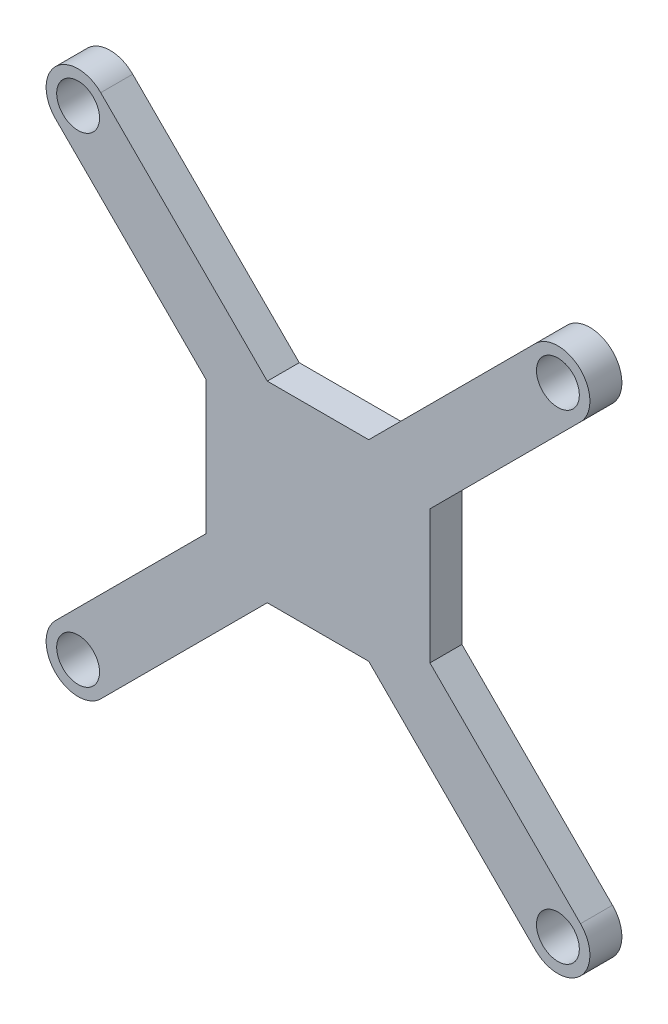
ISO-10303-21;
HEADER;
FILE_DESCRIPTION(('STEP AP214'),'2;1');
FILE_NAME('part.step','',(''),(''),'','','');
FILE_SCHEMA(('AUTOMOTIVE_DESIGN { 1 0 10303 214 1 1 1 1 }'));
ENDSEC;
DATA;
#1=APPLICATION_CONTEXT('core data for automotive mechanical design processes');
#2=APPLICATION_PROTOCOL_DEFINITION('international standard','automotive_design',2000,#1);
#3=PRODUCT_CONTEXT('',#1,'mechanical');
#4=PRODUCT('Part','Part','',(#3));
#5=PRODUCT_RELATED_PRODUCT_CATEGORY('part','',(#4));
#6=PRODUCT_DEFINITION_FORMATION('','',#4);
#7=PRODUCT_DEFINITION_CONTEXT('part definition',#1,'design');
#8=PRODUCT_DEFINITION('design','',#6,#7);
#9=PRODUCT_DEFINITION_SHAPE('','',#8);
#10=(LENGTH_UNIT() NAMED_UNIT(*) SI_UNIT(.MILLI.,.METRE.));
#11=(NAMED_UNIT(*) PLANE_ANGLE_UNIT() SI_UNIT($,.RADIAN.));
#12=(NAMED_UNIT(*) SI_UNIT($,.STERADIAN.) SOLID_ANGLE_UNIT());
#13=UNCERTAINTY_MEASURE_WITH_UNIT(LENGTH_MEASURE(1.E-05),#10,'distance_accuracy_value','');
#14=(GEOMETRIC_REPRESENTATION_CONTEXT(3) GLOBAL_UNCERTAINTY_ASSIGNED_CONTEXT((#13)) GLOBAL_UNIT_ASSIGNED_CONTEXT((#10,
#11,#12)) REPRESENTATION_CONTEXT('',''));
#15=CARTESIAN_POINT('',(0.,0.,0.));
#16=DIRECTION('',(0.,0.,1.));
#17=DIRECTION('',(1.,0.,0.));
#18=AXIS2_PLACEMENT_3D('',#15,#16,#17);
#19=CARTESIAN_POINT('',(37.4176023454291,33.3494710561995,5.));
#20=DIRECTION('',(0.,0.,-1.));
#21=DIRECTION('',(-1.,0.,0.));
#22=AXIS2_PLACEMENT_3D('',#19,#20,#21);
#23=CYLINDRICAL_SURFACE('',#22,5.);
#24=CARTESIAN_POINT('',(37.4176023454291,33.3494710561995,0.));
#25=DIRECTION('',(0.,0.,1.));
#26=DIRECTION('',(-1.,0.,0.));
#27=AXIS2_PLACEMENT_3D('',#24,#25,#26);
#28=CIRCLE('',#27,5.);
#29=CARTESIAN_POINT('',(40.9531362513617,29.8139371502666,0.));
#30=VERTEX_POINT('',#29);
#31=CARTESIAN_POINT('',(33.8820684394965,36.8850049621324,0.));
#32=VERTEX_POINT('',#31);
#33=EDGE_CURVE('E179',#30,#32,#28,.T.);
#34=ORIENTED_EDGE('',*,*,#33,.T.);
#35=DIRECTION('',(0.,0.,-1.));
#36=VECTOR('',#35,1.);
#37=CARTESIAN_POINT('',(33.8820684394965,36.8850049621324,5.));
#38=LINE('',#37,#36);
#39=CARTESIAN_POINT('',(33.8820684394965,36.8850049621324,5.));
#40=VERTEX_POINT('',#39);
#41=EDGE_CURVE('E11',#40,#32,#38,.T.);
#42=ORIENTED_EDGE('',*,*,#41,.F.);
#43=CARTESIAN_POINT('',(37.4176023454291,33.3494710561995,5.));
#44=DIRECTION('',(0.,0.,1.));
#45=DIRECTION('',(-1.,0.,0.));
#46=AXIS2_PLACEMENT_3D('',#43,#44,#45);
#47=CIRCLE('',#46,5.);
#48=CARTESIAN_POINT('',(40.9531362513617,29.8139371502666,5.));
#49=VERTEX_POINT('',#48);
#50=EDGE_CURVE('E210',#49,#40,#47,.T.);
#51=ORIENTED_EDGE('',*,*,#50,.F.);
#52=DIRECTION('',(0.,0.,-1.));
#53=VECTOR('',#52,1.);
#54=CARTESIAN_POINT('',(40.9531362513617,29.8139371502666,5.));
#55=LINE('',#54,#53);
#56=EDGE_CURVE('E175',#49,#30,#55,.T.);
#57=ORIENTED_EDGE('',*,*,#56,.T.);
#58=EDGE_LOOP('',(#34,#42,#51,#57));
#59=FACE_BOUND('',#58,.T.);
#60=ADVANCED_FACE('F35',(#59),#23,.T.);
#61=CARTESIAN_POINT('',(33.8820684394965,36.8850049621324,5.));
#62=DIRECTION('',(0.707106781186547,-0.707106781186548,0.));
#63=DIRECTION('',(0.707106781186548,0.707106781186547,0.));
#64=AXIS2_PLACEMENT_3D('',#61,#62,#63);
#65=PLANE('',#64);
#66=DIRECTION('',(-0.707106781186548,-0.707106781186547,0.));
#67=VECTOR('',#66,1.);
#68=CARTESIAN_POINT('',(33.8820684394965,36.8850049621324,0.));
#69=LINE('',#68,#67);
#70=CARTESIAN_POINT('',(7.84653453356363,10.8494710561995,0.));
#71=VERTEX_POINT('',#70);
#72=EDGE_CURVE('E182',#32,#71,#69,.T.);
#73=ORIENTED_EDGE('',*,*,#72,.T.);
#74=DIRECTION('',(0.,0.,-1.));
#75=VECTOR('',#74,1.);
#76=CARTESIAN_POINT('',(7.84653453356363,10.8494710561995,5.));
#77=LINE('',#76,#75);
#78=CARTESIAN_POINT('',(7.84653453356363,10.8494710561995,5.));
#79=VERTEX_POINT('',#78);
#80=EDGE_CURVE('E43',#79,#71,#77,.T.);
#81=ORIENTED_EDGE('',*,*,#80,.F.);
#82=DIRECTION('',(-0.707106781186548,-0.707106781186547,0.));
#83=VECTOR('',#82,1.);
#84=CARTESIAN_POINT('',(33.8820684394965,36.8850049621324,5.));
#85=LINE('',#84,#83);
#86=EDGE_CURVE('E118',#40,#79,#85,.T.);
#87=ORIENTED_EDGE('',*,*,#86,.F.);
#88=ORIENTED_EDGE('',*,*,#41,.T.);
#89=EDGE_LOOP('',(#73,#81,#87,#88));
#90=FACE_BOUND('',#89,.T.);
#91=ADVANCED_FACE('F309',(#90),#65,.F.);
#92=CARTESIAN_POINT('',(-8.01132984270473,10.8494710561995,5.));
#93=DIRECTION('',(0.,-1.,0.));
#94=DIRECTION('',(1.,0.,0.));
#95=AXIS2_PLACEMENT_3D('',#92,#93,#94);
#96=PLANE('',#95);
#97=DIRECTION('',(-1.,0.,0.));
#98=VECTOR('',#97,1.);
#99=CARTESIAN_POINT('',(-8.01132984270473,10.8494710561995,0.));
#100=LINE('',#99,#98);
#101=CARTESIAN_POINT('',(-8.01132984270473,10.8494710561995,0.));
#102=VERTEX_POINT('',#101);
#103=EDGE_CURVE('E185',#71,#102,#100,.T.);
#104=ORIENTED_EDGE('',*,*,#103,.T.);
#105=DIRECTION('',(0.,0.,-1.));
#106=VECTOR('',#105,1.);
#107=CARTESIAN_POINT('',(-8.01132984270473,10.8494710561995,5.));
#108=LINE('',#107,#106);
#109=CARTESIAN_POINT('',(-8.01132984270473,10.8494710561995,5.));
#110=VERTEX_POINT('',#109);
#111=EDGE_CURVE('E241',#110,#102,#108,.T.);
#112=ORIENTED_EDGE('',*,*,#111,.F.);
#113=DIRECTION('',(-1.,0.,0.));
#114=VECTOR('',#113,1.);
#115=CARTESIAN_POINT('',(-8.01132984270473,10.8494710561995,5.));
#116=LINE('',#115,#114);
#117=EDGE_CURVE('E249',#79,#110,#116,.T.);
#118=ORIENTED_EDGE('',*,*,#117,.F.);
#119=ORIENTED_EDGE('',*,*,#80,.T.);
#120=EDGE_LOOP('',(#104,#112,#118,#119));
#121=FACE_BOUND('',#120,.T.);
#122=ADVANCED_FACE('F247',(#121),#96,.F.);
#123=CARTESIAN_POINT('',(-34.0468637486376,36.8850049621324,5.));
#124=DIRECTION('',(-0.707106781186547,-0.707106781186548,0.));
#125=DIRECTION('',(0.707106781186548,-0.707106781186547,0.));
#126=AXIS2_PLACEMENT_3D('',#123,#124,#125);
#127=PLANE('',#126);
#128=DIRECTION('',(-0.707106781186548,0.707106781186547,0.));
#129=VECTOR('',#128,1.);
#130=CARTESIAN_POINT('',(-34.0468637486376,36.8850049621324,0.));
#131=LINE('',#130,#129);
#132=CARTESIAN_POINT('',(-34.0468637486376,36.8850049621324,0.));
#133=VERTEX_POINT('',#132);
#134=EDGE_CURVE('E187',#102,#133,#131,.T.);
#135=ORIENTED_EDGE('',*,*,#134,.T.);
#136=DIRECTION('',(0.,0.,-1.));
#137=VECTOR('',#136,1.);
#138=CARTESIAN_POINT('',(-34.0468637486376,36.8850049621324,5.));
#139=LINE('',#138,#137);
#140=CARTESIAN_POINT('',(-34.0468637486376,36.8850049621324,5.));
#141=VERTEX_POINT('',#140);
#142=EDGE_CURVE('E238',#141,#133,#139,.T.);
#143=ORIENTED_EDGE('',*,*,#142,.F.);
#144=DIRECTION('',(-0.707106781186548,0.707106781186547,0.));
#145=VECTOR('',#144,1.);
#146=CARTESIAN_POINT('',(-34.0468637486376,36.8850049621324,5.));
#147=LINE('',#146,#145);
#148=EDGE_CURVE('E267',#110,#141,#147,.T.);
#149=ORIENTED_EDGE('',*,*,#148,.F.);
#150=ORIENTED_EDGE('',*,*,#111,.T.);
#151=EDGE_LOOP('',(#135,#143,#149,#150));
#152=FACE_BOUND('',#151,.T.);
#153=ADVANCED_FACE('F258',(#152),#127,.F.);
#154=CARTESIAN_POINT('',(-37.5823976545702,33.3494710561995,5.));
#155=DIRECTION('',(0.,0.,-1.));
#156=DIRECTION('',(-1.,0.,0.));
#157=AXIS2_PLACEMENT_3D('',#154,#155,#156);
#158=CYLINDRICAL_SURFACE('',#157,5.);
#159=CARTESIAN_POINT('',(-37.5823976545702,33.3494710561995,0.));
#160=DIRECTION('',(0.,0.,1.));
#161=DIRECTION('',(1.,0.,0.));
#162=AXIS2_PLACEMENT_3D('',#159,#160,#161);
#163=CIRCLE('',#162,5.);
#164=CARTESIAN_POINT('',(-41.1179315605028,29.8139371502666,0.));
#165=VERTEX_POINT('',#164);
#166=EDGE_CURVE('E189',#133,#165,#163,.T.);
#167=ORIENTED_EDGE('',*,*,#166,.T.);
#168=DIRECTION('',(0.,0.,-1.));
#169=VECTOR('',#168,1.);
#170=CARTESIAN_POINT('',(-41.1179315605028,29.8139371502666,5.));
#171=LINE('',#170,#169);
#172=CARTESIAN_POINT('',(-41.1179315605028,29.8139371502666,5.));
#173=VERTEX_POINT('',#172);
#174=EDGE_CURVE('E235',#173,#165,#171,.T.);
#175=ORIENTED_EDGE('',*,*,#174,.F.);
#176=CARTESIAN_POINT('',(-37.5823976545702,33.3494710561995,5.));
#177=DIRECTION('',(0.,0.,1.));
#178=DIRECTION('',(1.,0.,0.));
#179=AXIS2_PLACEMENT_3D('',#176,#177,#178);
#180=CIRCLE('',#179,5.);
#181=EDGE_CURVE('E264',#141,#173,#180,.T.);
#182=ORIENTED_EDGE('',*,*,#181,.F.);
#183=ORIENTED_EDGE('',*,*,#142,.T.);
#184=EDGE_LOOP('',(#167,#175,#182,#183));
#185=FACE_BOUND('',#184,.T.);
#186=ADVANCED_FACE('F262',(#185),#158,.T.);
#187=CARTESIAN_POINT('',(-41.1179315605028,29.8139371502666,5.));
#188=DIRECTION('',(0.707106781186547,0.707106781186548,0.));
#189=DIRECTION('',(-0.707106781186548,0.707106781186547,0.));
#190=AXIS2_PLACEMENT_3D('',#187,#188,#189);
#191=PLANE('',#190);
#192=DIRECTION('',(0.707106781186548,-0.707106781186547,0.));
#193=VECTOR('',#192,1.);
#194=CARTESIAN_POINT('',(-41.1179315605028,29.8139371502666,0.));
#195=LINE('',#194,#193);
#196=CARTESIAN_POINT('',(-17.5823976545701,6.278403244334,0.));
#197=VERTEX_POINT('',#196);
#198=EDGE_CURVE('E191',#165,#197,#195,.T.);
#199=ORIENTED_EDGE('',*,*,#198,.T.);
#200=DIRECTION('',(0.,0.,-1.));
#201=VECTOR('',#200,1.);
#202=CARTESIAN_POINT('',(-17.5823976545701,6.278403244334,5.));
#203=LINE('',#202,#201);
#204=CARTESIAN_POINT('',(-17.5823976545701,6.278403244334,5.));
#205=VERTEX_POINT('',#204);
#206=EDGE_CURVE('E232',#205,#197,#203,.T.);
#207=ORIENTED_EDGE('',*,*,#206,.F.);
#208=DIRECTION('',(0.707106781186548,-0.707106781186547,0.));
#209=VECTOR('',#208,1.);
#210=CARTESIAN_POINT('',(-41.1179315605028,29.8139371502666,5.));
#211=LINE('',#210,#209);
#212=EDGE_CURVE('E266',#173,#205,#211,.T.);
#213=ORIENTED_EDGE('',*,*,#212,.F.);
#214=ORIENTED_EDGE('',*,*,#174,.T.);
#215=EDGE_LOOP('',(#199,#207,#213,#214));
#216=FACE_BOUND('',#215,.T.);
#217=ADVANCED_FACE('F322',(#216),#191,.F.);
#218=CARTESIAN_POINT('',(-17.5823976545701,-14.5794611319356,5.));
#219=DIRECTION('',(1.,0.,0.));
#220=DIRECTION('',(0.,1.,0.));
#221=AXIS2_PLACEMENT_3D('',#218,#219,#220);
#222=PLANE('',#221);
#223=DIRECTION('',(0.,-1.,0.));
#224=VECTOR('',#223,1.);
#225=CARTESIAN_POINT('',(-17.5823976545701,-14.5794611319356,0.));
#226=LINE('',#225,#224);
#227=CARTESIAN_POINT('',(-17.5823976545701,-14.5794611319356,0.));
#228=VERTEX_POINT('',#227);
#229=EDGE_CURVE('E193',#197,#228,#226,.T.);
#230=ORIENTED_EDGE('',*,*,#229,.T.);
#231=DIRECTION('',(0.,0.,-1.));
#232=VECTOR('',#231,1.);
#233=CARTESIAN_POINT('',(-17.5823976545701,-14.5794611319356,5.));
#234=LINE('',#233,#232);
#235=CARTESIAN_POINT('',(-17.5823976545701,-14.5794611319356,5.));
#236=VERTEX_POINT('',#235);
#237=EDGE_CURVE('E229',#236,#228,#234,.T.);
#238=ORIENTED_EDGE('',*,*,#237,.F.);
#239=DIRECTION('',(0.,-1.,0.));
#240=VECTOR('',#239,1.);
#241=CARTESIAN_POINT('',(-17.5823976545701,-14.5794611319356,5.));
#242=LINE('',#241,#240);
#243=EDGE_CURVE('E269',#205,#236,#242,.T.);
#244=ORIENTED_EDGE('',*,*,#243,.F.);
#245=ORIENTED_EDGE('',*,*,#206,.T.);
#246=EDGE_LOOP('',(#230,#238,#244,#245));
#247=FACE_BOUND('',#246,.T.);
#248=ADVANCED_FACE('F325',(#247),#222,.F.);
#249=CARTESIAN_POINT('',(-41.1179315605027,-38.1149950378682,5.));
#250=DIRECTION('',(0.707106781186548,-0.707106781186548,0.));
#251=DIRECTION('',(0.707106781186548,0.707106781186548,0.));
#252=AXIS2_PLACEMENT_3D('',#249,#250,#251);
#253=PLANE('',#252);
#254=DIRECTION('',(-0.707106781186548,-0.707106781186548,0.));
#255=VECTOR('',#254,1.);
#256=CARTESIAN_POINT('',(-41.1179315605027,-38.1149950378682,0.));
#257=LINE('',#256,#255);
#258=CARTESIAN_POINT('',(-41.1179315605027,-38.1149950378682,0.));
#259=VERTEX_POINT('',#258);
#260=EDGE_CURVE('E195',#228,#259,#257,.T.);
#261=ORIENTED_EDGE('',*,*,#260,.T.);
#262=DIRECTION('',(0.,0.,-1.));
#263=VECTOR('',#262,1.);
#264=CARTESIAN_POINT('',(-41.1179315605027,-38.1149950378682,5.));
#265=LINE('',#264,#263);
#266=CARTESIAN_POINT('',(-41.1179315605027,-38.1149950378682,5.));
#267=VERTEX_POINT('',#266);
#268=EDGE_CURVE('E226',#267,#259,#265,.T.);
#269=ORIENTED_EDGE('',*,*,#268,.F.);
#270=DIRECTION('',(-0.707106781186548,-0.707106781186548,0.));
#271=VECTOR('',#270,1.);
#272=CARTESIAN_POINT('',(-41.1179315605027,-38.1149950378682,5.));
#273=LINE('',#272,#271);
#274=EDGE_CURVE('E275',#236,#267,#273,.T.);
#275=ORIENTED_EDGE('',*,*,#274,.F.);
#276=ORIENTED_EDGE('',*,*,#237,.T.);
#277=EDGE_LOOP('',(#261,#269,#275,#276));
#278=FACE_BOUND('',#277,.T.);
#279=ADVANCED_FACE('F329',(#278),#253,.F.);
#280=CARTESIAN_POINT('',(-37.5823976545702,-41.6505289438011,5.));
#281=DIRECTION('',(0.,0.,-1.));
#282=DIRECTION('',(-1.,0.,0.));
#283=AXIS2_PLACEMENT_3D('',#280,#281,#282);
#284=CYLINDRICAL_SURFACE('',#283,4.99999999999999);
#285=CARTESIAN_POINT('',(-37.5823976545702,-41.6505289438011,0.));
#286=DIRECTION('',(0.,0.,1.));
#287=DIRECTION('',(-1.,0.,0.));
#288=AXIS2_PLACEMENT_3D('',#285,#286,#287);
#289=CIRCLE('',#288,4.99999999999999);
#290=CARTESIAN_POINT('',(-34.0468637486376,-45.1860628497339,0.));
#291=VERTEX_POINT('',#290);
#292=EDGE_CURVE('E197',#259,#291,#289,.T.);
#293=ORIENTED_EDGE('',*,*,#292,.T.);
#294=DIRECTION('',(0.,0.,-1.));
#295=VECTOR('',#294,1.);
#296=CARTESIAN_POINT('',(-34.0468637486376,-45.1860628497339,5.));
#297=LINE('',#296,#295);
#298=CARTESIAN_POINT('',(-34.0468637486376,-45.1860628497339,5.));
#299=VERTEX_POINT('',#298);
#300=EDGE_CURVE('E223',#299,#291,#297,.T.);
#301=ORIENTED_EDGE('',*,*,#300,.F.);
#302=CARTESIAN_POINT('',(-37.5823976545702,-41.6505289438011,5.));
#303=DIRECTION('',(0.,0.,1.));
#304=DIRECTION('',(-1.,0.,0.));
#305=AXIS2_PLACEMENT_3D('',#302,#303,#304);
#306=CIRCLE('',#305,4.99999999999999);
#307=EDGE_CURVE('E277',#267,#299,#306,.T.);
#308=ORIENTED_EDGE('',*,*,#307,.F.);
#309=ORIENTED_EDGE('',*,*,#268,.T.);
#310=EDGE_LOOP('',(#293,#301,#308,#309));
#311=FACE_BOUND('',#310,.T.);
#312=ADVANCED_FACE('F333',(#311),#284,.T.);
#313=CARTESIAN_POINT('',(-34.0468637486376,-45.1860628497339,5.));
#314=DIRECTION('',(-0.707106781186547,0.707106781186548,0.));
#315=DIRECTION('',(-0.707106781186548,-0.707106781186547,0.));
#316=AXIS2_PLACEMENT_3D('',#313,#314,#315);
#317=PLANE('',#316);
#318=DIRECTION('',(0.707106781186548,0.707106781186547,0.));
#319=VECTOR('',#318,1.);
#320=CARTESIAN_POINT('',(-34.0468637486376,-45.1860628497339,0.));
#321=LINE('',#320,#319);
#322=CARTESIAN_POINT('',(-8.01132984270472,-19.1505289438011,0.));
#323=VERTEX_POINT('',#322);
#324=EDGE_CURVE('E199',#291,#323,#321,.T.);
#325=ORIENTED_EDGE('',*,*,#324,.T.);
#326=DIRECTION('',(0.,0.,-1.));
#327=VECTOR('',#326,1.);
#328=CARTESIAN_POINT('',(-8.01132984270472,-19.1505289438011,5.));
#329=LINE('',#328,#327);
#330=CARTESIAN_POINT('',(-8.01132984270472,-19.1505289438011,5.));
#331=VERTEX_POINT('',#330);
#332=EDGE_CURVE('E220',#331,#323,#329,.T.);
#333=ORIENTED_EDGE('',*,*,#332,.F.);
#334=DIRECTION('',(0.707106781186548,0.707106781186547,0.));
#335=VECTOR('',#334,1.);
#336=CARTESIAN_POINT('',(-34.0468637486376,-45.1860628497339,5.));
#337=LINE('',#336,#335);
#338=EDGE_CURVE('E279',#299,#331,#337,.T.);
#339=ORIENTED_EDGE('',*,*,#338,.F.);
#340=ORIENTED_EDGE('',*,*,#300,.T.);
#341=EDGE_LOOP('',(#325,#333,#339,#340));
#342=FACE_BOUND('',#341,.T.);
#343=ADVANCED_FACE('F337',(#342),#317,.F.);
#344=CARTESIAN_POINT('',(-8.01132984270472,-19.1505289438011,5.));
#345=DIRECTION('',(0.,1.,0.));
#346=DIRECTION('',(-1.,0.,0.));
#347=AXIS2_PLACEMENT_3D('',#344,#345,#346);
#348=PLANE('',#347);
#349=DIRECTION('',(1.,0.,0.));
#350=VECTOR('',#349,1.);
#351=CARTESIAN_POINT('',(-8.01132984270472,-19.1505289438011,0.));
#352=LINE('',#351,#350);
#353=CARTESIAN_POINT('',(7.84653453356363,-19.1505289438011,0.));
#354=VERTEX_POINT('',#353);
#355=EDGE_CURVE('E201',#323,#354,#352,.T.);
#356=ORIENTED_EDGE('',*,*,#355,.T.);
#357=DIRECTION('',(0.,0.,-1.));
#358=VECTOR('',#357,1.);
#359=CARTESIAN_POINT('',(7.84653453356363,-19.1505289438011,5.));
#360=LINE('',#359,#358);
#361=CARTESIAN_POINT('',(7.84653453356363,-19.1505289438011,5.));
#362=VERTEX_POINT('',#361);
#363=EDGE_CURVE('E217',#362,#354,#360,.T.);
#364=ORIENTED_EDGE('',*,*,#363,.F.);
#365=DIRECTION('',(1.,0.,0.));
#366=VECTOR('',#365,1.);
#367=CARTESIAN_POINT('',(-8.01132984270472,-19.1505289438011,5.));
#368=LINE('',#367,#366);
#369=EDGE_CURVE('E281',#331,#362,#368,.T.);
#370=ORIENTED_EDGE('',*,*,#369,.F.);
#371=ORIENTED_EDGE('',*,*,#332,.T.);
#372=EDGE_LOOP('',(#356,#364,#370,#371));
#373=FACE_BOUND('',#372,.T.);
#374=ADVANCED_FACE('F341',(#373),#348,.F.);
#375=CARTESIAN_POINT('',(33.8820684394965,-45.1860628497339,5.));
#376=DIRECTION('',(0.707106781186547,0.707106781186548,0.));
#377=DIRECTION('',(-0.707106781186548,0.707106781186547,0.));
#378=AXIS2_PLACEMENT_3D('',#375,#376,#377);
#379=PLANE('',#378);
#380=DIRECTION('',(0.707106781186548,-0.707106781186547,0.));
#381=VECTOR('',#380,1.);
#382=CARTESIAN_POINT('',(33.8820684394965,-45.1860628497339,0.));
#383=LINE('',#382,#381);
#384=CARTESIAN_POINT('',(33.8820684394965,-45.1860628497339,0.));
#385=VERTEX_POINT('',#384);
#386=EDGE_CURVE('E203',#354,#385,#383,.T.);
#387=ORIENTED_EDGE('',*,*,#386,.T.);
#388=DIRECTION('',(0.,0.,-1.));
#389=VECTOR('',#388,1.);
#390=CARTESIAN_POINT('',(33.8820684394965,-45.1860628497339,5.));
#391=LINE('',#390,#389);
#392=CARTESIAN_POINT('',(33.8820684394965,-45.1860628497339,5.));
#393=VERTEX_POINT('',#392);
#394=EDGE_CURVE('E214',#393,#385,#391,.T.);
#395=ORIENTED_EDGE('',*,*,#394,.F.);
#396=DIRECTION('',(0.707106781186548,-0.707106781186547,0.));
#397=VECTOR('',#396,1.);
#398=CARTESIAN_POINT('',(33.8820684394965,-45.1860628497339,5.));
#399=LINE('',#398,#397);
#400=EDGE_CURVE('E283',#362,#393,#399,.T.);
#401=ORIENTED_EDGE('',*,*,#400,.F.);
#402=ORIENTED_EDGE('',*,*,#363,.T.);
#403=EDGE_LOOP('',(#387,#395,#401,#402));
#404=FACE_BOUND('',#403,.T.);
#405=ADVANCED_FACE('F289',(#404),#379,.F.);
#406=CARTESIAN_POINT('',(37.4176023454291,-41.6505289438011,5.));
#407=DIRECTION('',(0.,0.,-1.));
#408=DIRECTION('',(-1.,0.,0.));
#409=AXIS2_PLACEMENT_3D('',#406,#407,#408);
#410=CYLINDRICAL_SURFACE('',#409,5.);
#411=CARTESIAN_POINT('',(37.4176023454291,-41.6505289438011,0.));
#412=DIRECTION('',(0.,0.,1.));
#413=DIRECTION('',(1.,0.,0.));
#414=AXIS2_PLACEMENT_3D('',#411,#412,#413);
#415=CIRCLE('',#414,5.);
#416=CARTESIAN_POINT('',(40.9531362513617,-38.1149950378682,0.));
#417=VERTEX_POINT('',#416);
#418=EDGE_CURVE('E205',#385,#417,#415,.T.);
#419=ORIENTED_EDGE('',*,*,#418,.T.);
#420=DIRECTION('',(0.,0.,-1.));
#421=VECTOR('',#420,1.);
#422=CARTESIAN_POINT('',(40.9531362513617,-38.1149950378682,5.));
#423=LINE('',#422,#421);
#424=CARTESIAN_POINT('',(40.9531362513617,-38.1149950378682,5.));
#425=VERTEX_POINT('',#424);
#426=EDGE_CURVE('E170',#425,#417,#423,.T.);
#427=ORIENTED_EDGE('',*,*,#426,.F.);
#428=CARTESIAN_POINT('',(37.4176023454291,-41.6505289438011,5.));
#429=DIRECTION('',(0.,0.,1.));
#430=DIRECTION('',(1.,0.,0.));
#431=AXIS2_PLACEMENT_3D('',#428,#429,#430);
#432=CIRCLE('',#431,5.);
#433=EDGE_CURVE('E161',#393,#425,#432,.T.);
#434=ORIENTED_EDGE('',*,*,#433,.F.);
#435=ORIENTED_EDGE('',*,*,#394,.T.);
#436=EDGE_LOOP('',(#419,#427,#434,#435));
#437=FACE_BOUND('',#436,.T.);
#438=ADVANCED_FACE('F293',(#437),#410,.T.);
#439=CARTESIAN_POINT('',(40.9531362513617,-38.1149950378682,5.));
#440=DIRECTION('',(-0.707106781186547,-0.707106781186548,0.));
#441=DIRECTION('',(0.707106781186548,-0.707106781186547,0.));
#442=AXIS2_PLACEMENT_3D('',#439,#440,#441);
#443=PLANE('',#442);
#444=DIRECTION('',(-0.707106781186548,0.707106781186547,0.));
#445=VECTOR('',#444,1.);
#446=CARTESIAN_POINT('',(40.9531362513617,-38.1149950378682,0.));
#447=LINE('',#446,#445);
#448=CARTESIAN_POINT('',(17.417602345429,-14.5794611319356,0.));
#449=VERTEX_POINT('',#448);
#450=EDGE_CURVE('E169',#417,#449,#447,.T.);
#451=ORIENTED_EDGE('',*,*,#450,.T.);
#452=DIRECTION('',(0.,0.,-1.));
#453=VECTOR('',#452,1.);
#454=CARTESIAN_POINT('',(17.417602345429,-14.5794611319356,5.));
#455=LINE('',#454,#453);
#456=CARTESIAN_POINT('',(17.417602345429,-14.5794611319356,5.));
#457=VERTEX_POINT('',#456);
#458=EDGE_CURVE('E166',#457,#449,#455,.T.);
#459=ORIENTED_EDGE('',*,*,#458,.F.);
#460=DIRECTION('',(-0.707106781186548,0.707106781186547,0.));
#461=VECTOR('',#460,1.);
#462=CARTESIAN_POINT('',(40.9531362513617,-38.1149950378682,5.));
#463=LINE('',#462,#461);
#464=EDGE_CURVE('E155',#425,#457,#463,.T.);
#465=ORIENTED_EDGE('',*,*,#464,.F.);
#466=ORIENTED_EDGE('',*,*,#426,.T.);
#467=EDGE_LOOP('',(#451,#459,#465,#466));
#468=FACE_BOUND('',#467,.T.);
#469=ADVANCED_FACE('F167',(#468),#443,.F.);
#470=CARTESIAN_POINT('',(17.417602345429,-14.5794611319356,5.));
#471=DIRECTION('',(-1.,0.,0.));
#472=DIRECTION('',(0.,0.,1.));
#473=AXIS2_PLACEMENT_3D('',#470,#471,#472);
#474=PLANE('',#473);
#475=DIRECTION('',(0.,1.,0.));
#476=VECTOR('',#475,1.);
#477=CARTESIAN_POINT('',(17.417602345429,-14.5794611319356,0.));
#478=LINE('',#477,#476);
#479=CARTESIAN_POINT('',(17.417602345429,6.278403244334,0.));
#480=VERTEX_POINT('',#479);
#481=EDGE_CURVE('E104',#449,#480,#478,.T.);
#482=ORIENTED_EDGE('',*,*,#481,.T.);
#483=DIRECTION('',(0.,0.,-1.));
#484=VECTOR('',#483,1.);
#485=CARTESIAN_POINT('',(17.417602345429,6.278403244334,5.));
#486=LINE('',#485,#484);
#487=CARTESIAN_POINT('',(17.417602345429,6.278403244334,5.));
#488=VERTEX_POINT('',#487);
#489=EDGE_CURVE('E171',#488,#480,#486,.T.);
#490=ORIENTED_EDGE('',*,*,#489,.F.);
#491=DIRECTION('',(0.,1.,0.));
#492=VECTOR('',#491,1.);
#493=CARTESIAN_POINT('',(17.417602345429,-14.5794611319356,5.));
#494=LINE('',#493,#492);
#495=EDGE_CURVE('E159',#457,#488,#494,.T.);
#496=ORIENTED_EDGE('',*,*,#495,.F.);
#497=ORIENTED_EDGE('',*,*,#458,.T.);
#498=EDGE_LOOP('',(#482,#490,#496,#497));
#499=FACE_BOUND('',#498,.T.);
#500=ADVANCED_FACE('F173',(#499),#474,.F.);
#501=CARTESIAN_POINT('',(40.9531362513617,29.8139371502666,5.));
#502=DIRECTION('',(-0.707106781186547,0.707106781186548,0.));
#503=DIRECTION('',(-0.707106781186548,-0.707106781186547,0.));
#504=AXIS2_PLACEMENT_3D('',#501,#502,#503);
#505=PLANE('',#504);
#506=DIRECTION('',(0.707106781186548,0.707106781186547,0.));
#507=VECTOR('',#506,1.);
#508=CARTESIAN_POINT('',(40.9531362513617,29.8139371502666,0.));
#509=LINE('',#508,#507);
#510=EDGE_CURVE('E110',#480,#30,#509,.T.);
#511=ORIENTED_EDGE('',*,*,#510,.T.);
#512=ORIENTED_EDGE('',*,*,#56,.F.);
#513=DIRECTION('',(0.707106781186548,0.707106781186547,0.));
#514=VECTOR('',#513,1.);
#515=CARTESIAN_POINT('',(40.9531362513617,29.8139371502666,5.));
#516=LINE('',#515,#514);
#517=EDGE_CURVE('E51',#488,#49,#516,.T.);
#518=ORIENTED_EDGE('',*,*,#517,.F.);
#519=ORIENTED_EDGE('',*,*,#489,.T.);
#520=EDGE_LOOP('',(#511,#512,#518,#519));
#521=FACE_BOUND('',#520,.T.);
#522=ADVANCED_FACE('F297',(#521),#505,.F.);
#523=CARTESIAN_POINT('',(37.4176023454291,33.3494710561995,5.));
#524=DIRECTION('',(0.,0.,-1.));
#525=DIRECTION('',(-1.,0.,0.));
#526=AXIS2_PLACEMENT_3D('',#523,#524,#525);
#527=PLANE('',#526);
#528=CARTESIAN_POINT('',(37.4176023454291,33.3494710561995,5.));
#529=DIRECTION('',(0.,0.,1.));
#530=DIRECTION('',(1.,0.,0.));
#531=AXIS2_PLACEMENT_3D('',#528,#529,#530);
#532=CIRCLE('',#531,3.35);
#533=CARTESIAN_POINT('',(40.7676023454291,33.3494710561995,5.));
#534=VERTEX_POINT('',#533);
#535=EDGE_CURVE('E427',#534,#534,#532,.T.);
#536=ORIENTED_EDGE('',*,*,#535,.F.);
#537=EDGE_LOOP('',(#536));
#538=FACE_BOUND('',#537,.T.);
#539=CARTESIAN_POINT('',(37.4176023454291,-41.6505289438011,5.));
#540=DIRECTION('',(0.,0.,1.));
#541=DIRECTION('',(1.,0.,0.));
#542=AXIS2_PLACEMENT_3D('',#539,#540,#541);
#543=CIRCLE('',#542,3.35);
#544=CARTESIAN_POINT('',(40.7676023454291,-41.6505289438011,5.));
#545=VERTEX_POINT('',#544);
#546=EDGE_CURVE('E433',#545,#545,#543,.T.);
#547=ORIENTED_EDGE('',*,*,#546,.F.);
#548=EDGE_LOOP('',(#547));
#549=FACE_BOUND('',#548,.T.);
#550=CARTESIAN_POINT('',(-37.5823976545702,-41.6505289438011,5.));
#551=DIRECTION('',(0.,0.,1.));
#552=DIRECTION('',(1.,0.,0.));
#553=AXIS2_PLACEMENT_3D('',#550,#551,#552);
#554=CIRCLE('',#553,3.35);
#555=CARTESIAN_POINT('',(-34.2323976545702,-41.6505289438011,5.));
#556=VERTEX_POINT('',#555);
#557=EDGE_CURVE('E441',#556,#556,#554,.T.);
#558=ORIENTED_EDGE('',*,*,#557,.F.);
#559=EDGE_LOOP('',(#558));
#560=FACE_BOUND('',#559,.T.);
#561=CARTESIAN_POINT('',(-37.5823976545702,33.3494710561995,5.));
#562=DIRECTION('',(0.,0.,1.));
#563=DIRECTION('',(1.,0.,0.));
#564=AXIS2_PLACEMENT_3D('',#561,#562,#563);
#565=CIRCLE('',#564,3.35);
#566=CARTESIAN_POINT('',(-34.2323976545702,33.3494710561995,5.));
#567=VERTEX_POINT('',#566);
#568=EDGE_CURVE('E430',#567,#567,#565,.T.);
#569=ORIENTED_EDGE('',*,*,#568,.F.);
#570=EDGE_LOOP('',(#569));
#571=FACE_BOUND('',#570,.T.);
#572=ORIENTED_EDGE('',*,*,#50,.T.);
#573=ORIENTED_EDGE('',*,*,#86,.T.);
#574=ORIENTED_EDGE('',*,*,#117,.T.);
#575=ORIENTED_EDGE('',*,*,#148,.T.);
#576=ORIENTED_EDGE('',*,*,#181,.T.);
#577=ORIENTED_EDGE('',*,*,#212,.T.);
#578=ORIENTED_EDGE('',*,*,#243,.T.);
#579=ORIENTED_EDGE('',*,*,#274,.T.);
#580=ORIENTED_EDGE('',*,*,#307,.T.);
#581=ORIENTED_EDGE('',*,*,#338,.T.);
#582=ORIENTED_EDGE('',*,*,#369,.T.);
#583=ORIENTED_EDGE('',*,*,#400,.T.);
#584=ORIENTED_EDGE('',*,*,#433,.T.);
#585=ORIENTED_EDGE('',*,*,#464,.T.);
#586=ORIENTED_EDGE('',*,*,#495,.T.);
#587=ORIENTED_EDGE('',*,*,#517,.T.);
#588=EDGE_LOOP('',(#572,#573,#574,#575,#576,#577,#578,#579,#580,#581,#582,#583,#584,#585,#586,#587));
#589=FACE_BOUND('',#588,.T.);
#590=ADVANCED_FACE('F157',(#538,#549,#560,#571,#589),#527,.F.);
#591=CARTESIAN_POINT('',(37.4176023454291,33.3494710561995,0.));
#592=DIRECTION('',(0.,0.,-1.));
#593=DIRECTION('',(-1.,0.,0.));
#594=AXIS2_PLACEMENT_3D('',#591,#592,#593);
#595=PLANE('',#594);
#596=CARTESIAN_POINT('',(37.4176023454291,33.3494710561995,0.));
#597=DIRECTION('',(0.,0.,1.));
#598=DIRECTION('',(1.,0.,0.));
#599=AXIS2_PLACEMENT_3D('',#596,#597,#598);
#600=CIRCLE('',#599,3.35);
#601=CARTESIAN_POINT('',(40.7676023454291,33.3494710561995,0.));
#602=VERTEX_POINT('',#601);
#603=EDGE_CURVE('E424',#602,#602,#600,.T.);
#604=ORIENTED_EDGE('',*,*,#603,.T.);
#605=EDGE_LOOP('',(#604));
#606=FACE_BOUND('',#605,.T.);
#607=CARTESIAN_POINT('',(37.4176023454291,-41.6505289438011,0.));
#608=DIRECTION('',(0.,0.,1.));
#609=DIRECTION('',(1.,0.,0.));
#610=AXIS2_PLACEMENT_3D('',#607,#608,#609);
#611=CIRCLE('',#610,3.35);
#612=CARTESIAN_POINT('',(40.7676023454291,-41.6505289438011,0.));
#613=VERTEX_POINT('',#612);
#614=EDGE_CURVE('E428',#613,#613,#611,.T.);
#615=ORIENTED_EDGE('',*,*,#614,.T.);
#616=EDGE_LOOP('',(#615));
#617=FACE_BOUND('',#616,.T.);
#618=CARTESIAN_POINT('',(-37.5823976545702,-41.6505289438011,0.));
#619=DIRECTION('',(0.,0.,1.));
#620=DIRECTION('',(1.,0.,0.));
#621=AXIS2_PLACEMENT_3D('',#618,#619,#620);
#622=CIRCLE('',#621,3.35);
#623=CARTESIAN_POINT('',(-34.2323976545702,-41.6505289438011,0.));
#624=VERTEX_POINT('',#623);
#625=EDGE_CURVE('E438',#624,#624,#622,.T.);
#626=ORIENTED_EDGE('',*,*,#625,.T.);
#627=EDGE_LOOP('',(#626));
#628=FACE_BOUND('',#627,.T.);
#629=CARTESIAN_POINT('',(-37.5823976545702,33.3494710561995,0.));
#630=DIRECTION('',(0.,0.,1.));
#631=DIRECTION('',(1.,0.,0.));
#632=AXIS2_PLACEMENT_3D('',#629,#630,#631);
#633=CIRCLE('',#632,3.35);
#634=CARTESIAN_POINT('',(-34.2323976545702,33.3494710561995,0.));
#635=VERTEX_POINT('',#634);
#636=EDGE_CURVE('E183',#635,#635,#633,.T.);
#637=ORIENTED_EDGE('',*,*,#636,.T.);
#638=EDGE_LOOP('',(#637));
#639=FACE_BOUND('',#638,.T.);
#640=ORIENTED_EDGE('',*,*,#33,.F.);
#641=ORIENTED_EDGE('',*,*,#510,.F.);
#642=ORIENTED_EDGE('',*,*,#481,.F.);
#643=ORIENTED_EDGE('',*,*,#450,.F.);
#644=ORIENTED_EDGE('',*,*,#418,.F.);
#645=ORIENTED_EDGE('',*,*,#386,.F.);
#646=ORIENTED_EDGE('',*,*,#355,.F.);
#647=ORIENTED_EDGE('',*,*,#324,.F.);
#648=ORIENTED_EDGE('',*,*,#292,.F.);
#649=ORIENTED_EDGE('',*,*,#260,.F.);
#650=ORIENTED_EDGE('',*,*,#229,.F.);
#651=ORIENTED_EDGE('',*,*,#198,.F.);
#652=ORIENTED_EDGE('',*,*,#166,.F.);
#653=ORIENTED_EDGE('',*,*,#134,.F.);
#654=ORIENTED_EDGE('',*,*,#103,.F.);
#655=ORIENTED_EDGE('',*,*,#72,.F.);
#656=EDGE_LOOP('',(#640,#641,#642,#643,#644,#645,#646,#647,#648,#649,#650,#651,#652,#653,#654,#655));
#657=FACE_BOUND('',#656,.T.);
#658=ADVANCED_FACE('F253',(#606,#617,#628,#639,#657),#595,.T.);
#659=CARTESIAN_POINT('',(-37.5823976545702,33.3494710561995,0.));
#660=DIRECTION('',(0.,0.,1.));
#661=DIRECTION('',(1.,0.,0.));
#662=AXIS2_PLACEMENT_3D('',#659,#660,#661);
#663=CYLINDRICAL_SURFACE('',#662,3.35);
#664=ORIENTED_EDGE('',*,*,#636,.F.);
#665=EDGE_LOOP('',(#664));
#666=FACE_BOUND('',#665,.T.);
#667=ORIENTED_EDGE('',*,*,#568,.T.);
#668=EDGE_LOOP('',(#667));
#669=FACE_BOUND('',#668,.T.);
#670=ADVANCED_FACE('F378',(#666,#669),#663,.F.);
#671=CARTESIAN_POINT('',(-37.5823976545702,-41.6505289438011,0.));
#672=DIRECTION('',(0.,0.,1.));
#673=DIRECTION('',(1.,0.,0.));
#674=AXIS2_PLACEMENT_3D('',#671,#672,#673);
#675=CYLINDRICAL_SURFACE('',#674,3.35);
#676=ORIENTED_EDGE('',*,*,#625,.F.);
#677=EDGE_LOOP('',(#676));
#678=FACE_BOUND('',#677,.T.);
#679=ORIENTED_EDGE('',*,*,#557,.T.);
#680=EDGE_LOOP('',(#679));
#681=FACE_BOUND('',#680,.T.);
#682=ADVANCED_FACE('F387',(#678,#681),#675,.F.);
#683=CARTESIAN_POINT('',(37.4176023454291,-41.6505289438011,0.));
#684=DIRECTION('',(0.,0.,1.));
#685=DIRECTION('',(1.,0.,0.));
#686=AXIS2_PLACEMENT_3D('',#683,#684,#685);
#687=CYLINDRICAL_SURFACE('',#686,3.35);
#688=ORIENTED_EDGE('',*,*,#614,.F.);
#689=EDGE_LOOP('',(#688));
#690=FACE_BOUND('',#689,.T.);
#691=ORIENTED_EDGE('',*,*,#546,.T.);
#692=EDGE_LOOP('',(#691));
#693=FACE_BOUND('',#692,.T.);
#694=ADVANCED_FACE('F397',(#690,#693),#687,.F.);
#695=CARTESIAN_POINT('',(37.4176023454291,33.3494710561995,0.));
#696=DIRECTION('',(0.,0.,1.));
#697=DIRECTION('',(1.,0.,0.));
#698=AXIS2_PLACEMENT_3D('',#695,#696,#697);
#699=CYLINDRICAL_SURFACE('',#698,3.35);
#700=ORIENTED_EDGE('',*,*,#603,.F.);
#701=EDGE_LOOP('',(#700));
#702=FACE_BOUND('',#701,.T.);
#703=ORIENTED_EDGE('',*,*,#535,.T.);
#704=EDGE_LOOP('',(#703));
#705=FACE_BOUND('',#704,.T.);
#706=ADVANCED_FACE('F407',(#702,#705),#699,.F.);
#707=CLOSED_SHELL('',(#60,#91,#122,#153,#186,#217,#248,#279,#312,#343,#374,#405,#438,#469,#500,
#522,#590,#658,#670,#682,#694,#706));
#708=MANIFOLD_SOLID_BREP('B2',#707);
#709=ADVANCED_BREP_SHAPE_REPRESENTATION('',(#18,#708),#14);
#710=SHAPE_DEFINITION_REPRESENTATION(#9,#709);
ENDSEC;
END-ISO-10303-21;
